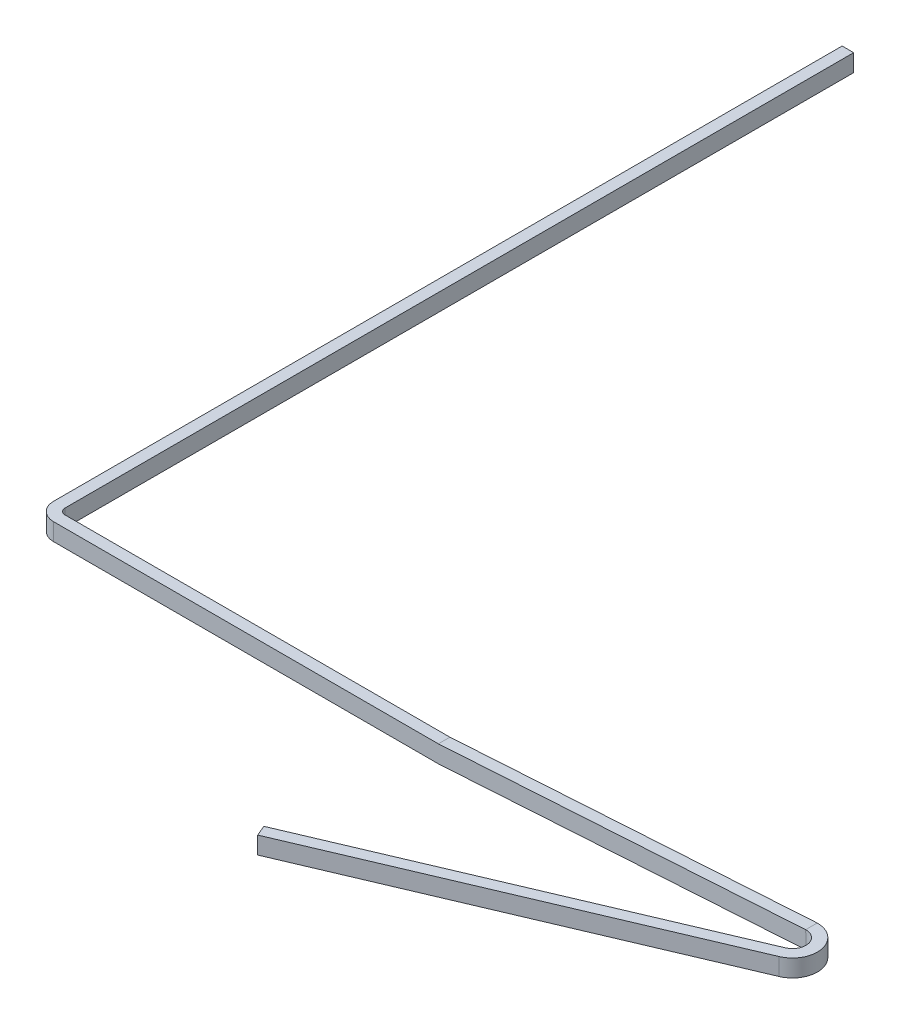
ISO-10303-21;
HEADER;
FILE_DESCRIPTION(('STEP AP214'),'2;1');
FILE_NAME('part.step','',(''),(''),'','','');
FILE_SCHEMA(('AUTOMOTIVE_DESIGN { 1 0 10303 214 1 1 1 1 }'));
ENDSEC;
DATA;
#1=APPLICATION_CONTEXT('core data for automotive mechanical design processes');
#2=APPLICATION_PROTOCOL_DEFINITION('international standard','automotive_design',2000,#1);
#3=PRODUCT_CONTEXT('',#1,'mechanical');
#4=PRODUCT('Part','Part','',(#3));
#5=PRODUCT_RELATED_PRODUCT_CATEGORY('part','',(#4));
#6=PRODUCT_DEFINITION_FORMATION('','',#4);
#7=PRODUCT_DEFINITION_CONTEXT('part definition',#1,'design');
#8=PRODUCT_DEFINITION('design','',#6,#7);
#9=PRODUCT_DEFINITION_SHAPE('','',#8);
#10=(LENGTH_UNIT() NAMED_UNIT(*) SI_UNIT(.MILLI.,.METRE.));
#11=(NAMED_UNIT(*) PLANE_ANGLE_UNIT() SI_UNIT($,.RADIAN.));
#12=(NAMED_UNIT(*) SI_UNIT($,.STERADIAN.) SOLID_ANGLE_UNIT());
#13=UNCERTAINTY_MEASURE_WITH_UNIT(LENGTH_MEASURE(1.E-05),#10,'distance_accuracy_value','');
#14=(GEOMETRIC_REPRESENTATION_CONTEXT(3) GLOBAL_UNCERTAINTY_ASSIGNED_CONTEXT((#13)) GLOBAL_UNIT_ASSIGNED_CONTEXT((#10,
#11,#12)) REPRESENTATION_CONTEXT('',''));
#15=CARTESIAN_POINT('',(0.,0.,0.));
#16=DIRECTION('',(0.,0.,1.));
#17=DIRECTION('',(1.,0.,0.));
#18=AXIS2_PLACEMENT_3D('',#15,#16,#17);
#19=CARTESIAN_POINT('',(0.31,-0.225,20.64));
#20=DIRECTION('',(0.,0.,-1.));
#21=DIRECTION('',(0.,1.,0.));
#22=AXIS2_PLACEMENT_3D('',#19,#20,#21);
#23=PLANE('',#22);
#24=DIRECTION('',(1.,0.,0.));
#25=VECTOR('',#24,1.);
#26=CARTESIAN_POINT('',(5.08347545353896,-0.225,20.64));
#27=LINE('',#26,#25);
#28=CARTESIAN_POINT('',(0.31,-0.225,20.64));
#29=VERTEX_POINT('',#28);
#30=CARTESIAN_POINT('',(10.3169509070779,-0.225,20.64));
#31=VERTEX_POINT('',#30);
#32=EDGE_CURVE('E289',#29,#31,#27,.T.);
#33=ORIENTED_EDGE('',*,*,#32,.F.);
#34=DIRECTION('',(0.,-1.,0.));
#35=VECTOR('',#34,1.);
#36=CARTESIAN_POINT('',(0.31,0.,20.64));
#37=LINE('',#36,#35);
#38=CARTESIAN_POINT('',(0.31,0.225,20.64));
#39=VERTEX_POINT('',#38);
#40=EDGE_CURVE('E313',#39,#29,#37,.T.);
#41=ORIENTED_EDGE('',*,*,#40,.F.);
#42=DIRECTION('',(-1.,0.,0.));
#43=VECTOR('',#42,1.);
#44=CARTESIAN_POINT('',(5.07652454646103,0.225,20.64));
#45=LINE('',#44,#43);
#46=CARTESIAN_POINT('',(10.3030490929221,0.225,20.64));
#47=VERTEX_POINT('',#46);
#48=EDGE_CURVE('E263',#47,#39,#45,.T.);
#49=ORIENTED_EDGE('',*,*,#48,.F.);
#50=DIRECTION('',(-0.998093074861909,-0.0617269302063447,0.));
#51=VECTOR('',#50,1.);
#52=CARTESIAN_POINT('',(15.073049092922,0.52,20.64));
#53=LINE('',#52,#51);
#54=CARTESIAN_POINT('',(19.8430490930153,0.815,20.6399992317516));
#55=VERTEX_POINT('',#54);
#56=EDGE_CURVE('E132',#55,#47,#53,.T.);
#57=ORIENTED_EDGE('',*,*,#56,.F.);
#58=CARTESIAN_POINT('',(19.8569503056948,0.365,20.6400473325914));
#59=CARTESIAN_POINT('',(19.8563251224778,0.383749856004702,20.6400393590207));
#60=CARTESIAN_POINT('',(19.8557040982407,0.402499851828986,20.6400324284622));
#61=CARTESIAN_POINT('',(19.8544713112831,0.439999843482708,20.6400205648319));
#62=CARTESIAN_POINT('',(19.8538595484122,0.458749839307196,20.6400156317276));
#63=CARTESIAN_POINT('',(19.8526462176853,0.496249841722893,20.6400076742821));
#64=CARTESIAN_POINT('',(19.8520446496561,0.514999848308494,20.6400046499084));
#65=CARTESIAN_POINT('',(19.8508506054591,0.552499815189423,20.640000941061));
#66=CARTESIAN_POINT('',(19.8502581291284,0.571249775479543,20.6400002565452));
#67=CARTESIAN_POINT('',(19.8490901129872,0.608749737456597,20.6399993823469));
#68=CARTESIAN_POINT('',(19.8485145727373,0.627499739129803,20.6399991926516));
#69=CARTESIAN_POINT('',(19.8473806719816,0.664999754281843,20.6399987753335));
#70=CARTESIAN_POINT('',(19.8468223110122,0.683749767746673,20.6399985477119));
#71=CARTESIAN_POINT('',(19.8457205182736,0.72124979070241,20.6399981852578));
#72=CARTESIAN_POINT('',(19.8451770861531,0.739999800183013,20.6399980504232));
#73=CARTESIAN_POINT('',(19.8441035231497,0.777499819151371,20.6399978383952));
#74=CARTESIAN_POINT('',(19.8435733919971,0.796249828631397,20.6399977612006));
#75=CARTESIAN_POINT('',(19.8430490932017,0.815,20.6399976952547));
#76=B_SPLINE_CURVE_WITH_KNOTS('',3,(#58,#59,#60,#61,#62,#63,#64,#65,#66,#67,#68,#69,#70,#71,#72,
#73,#74,#75),.UNSPECIFIED.,.F.,.F.,(4,2,2,2,2,2,2,2,4),(0.,0.0562808336383738,0.112560752718007,
0.168839714387137,0.225117666038422,0.281394155789539,0.337669125081047,0.393942769148206,
0.450215270750666),.UNSPECIFIED.);
#77=CARTESIAN_POINT('',(19.856950709507,0.364999999999999,20.6400217609745));
#78=VERTEX_POINT('',#77);
#79=EDGE_CURVE('E120',#55,#78,#76,.F.);
#80=ORIENTED_EDGE('',*,*,#79,.T.);
#81=DIRECTION('',(0.998093074861909,0.0617269302063444,0.));
#82=VECTOR('',#81,1.);
#83=CARTESIAN_POINT('',(15.0869509070779,0.07,20.64));
#84=LINE('',#83,#82);
#85=EDGE_CURVE('E147',#31,#78,#84,.T.);
#86=ORIENTED_EDGE('',*,*,#85,.F.);
#87=EDGE_LOOP('',(#33,#41,#49,#57,#80,#86));
#88=FACE_BOUND('',#87,.T.);
#89=ADVANCED_FACE('F15',(#88),#23,.T.);
#90=CARTESIAN_POINT('',(0.31,-0.27,20.48));
#91=DIRECTION('',(0.,1.,0.));
#92=DIRECTION('',(0.,0.,1.));
#93=AXIS2_PLACEMENT_3D('',#90,#91,#92);
#94=CYLINDRICAL_SURFACE('',#93,0.160000000000002);
#95=DIRECTION('',(0.,-1.,0.));
#96=VECTOR('',#95,1.);
#97=CARTESIAN_POINT('',(0.15,0.,20.48));
#98=LINE('',#97,#96);
#99=CARTESIAN_POINT('',(0.149999999999996,0.225,20.48));
#100=VERTEX_POINT('',#99);
#101=CARTESIAN_POINT('',(0.149999999999988,-0.225,20.48));
#102=VERTEX_POINT('',#101);
#103=EDGE_CURVE('E99',#100,#102,#98,.T.);
#104=ORIENTED_EDGE('',*,*,#103,.F.);
#105=CARTESIAN_POINT('',(0.31,0.225,20.48));
#106=DIRECTION('',(0.,1.,0.));
#107=DIRECTION('',(0.,0.,1.));
#108=AXIS2_PLACEMENT_3D('',#105,#106,#107);
#109=CIRCLE('',#108,0.160000000000002);
#110=EDGE_CURVE('E490',#39,#100,#109,.F.);
#111=ORIENTED_EDGE('',*,*,#110,.F.);
#112=ORIENTED_EDGE('',*,*,#40,.T.);
#113=CARTESIAN_POINT('',(0.31,-0.225,20.48));
#114=DIRECTION('',(0.,1.,0.));
#115=DIRECTION('',(0.,0.,1.));
#116=AXIS2_PLACEMENT_3D('',#113,#114,#115);
#117=CIRCLE('',#116,0.160000000000002);
#118=EDGE_CURVE('E19',#102,#29,#117,.T.);
#119=ORIENTED_EDGE('',*,*,#118,.F.);
#120=EDGE_LOOP('',(#104,#111,#112,#119));
#121=FACE_BOUND('',#120,.T.);
#122=ADVANCED_FACE('F467',(#121),#94,.F.);
#123=CARTESIAN_POINT('',(0.15,-0.225,0.));
#124=DIRECTION('',(1.,0.,0.));
#125=DIRECTION('',(0.,1.,0.));
#126=AXIS2_PLACEMENT_3D('',#123,#124,#125);
#127=PLANE('',#126);
#128=DIRECTION('',(0.,-1.,0.));
#129=VECTOR('',#128,1.);
#130=CARTESIAN_POINT('',(0.15,0.,0.));
#131=LINE('',#130,#129);
#132=CARTESIAN_POINT('',(0.149999999999995,0.225,0.));
#133=VERTEX_POINT('',#132);
#134=CARTESIAN_POINT('',(0.149999999999989,-0.225,0.));
#135=VERTEX_POINT('',#134);
#136=EDGE_CURVE('E111',#133,#135,#131,.T.);
#137=ORIENTED_EDGE('',*,*,#136,.F.);
#138=DIRECTION('',(0.,0.,-1.));
#139=VECTOR('',#138,1.);
#140=CARTESIAN_POINT('',(0.149999999999992,0.225,10.47));
#141=LINE('',#140,#139);
#142=EDGE_CURVE('E306',#100,#133,#141,.T.);
#143=ORIENTED_EDGE('',*,*,#142,.F.);
#144=ORIENTED_EDGE('',*,*,#103,.T.);
#145=DIRECTION('',(0.,0.,1.));
#146=VECTOR('',#145,1.);
#147=CARTESIAN_POINT('',(0.149999999999976,-0.225,10.47));
#148=LINE('',#147,#146);
#149=EDGE_CURVE('E280',#135,#102,#148,.T.);
#150=ORIENTED_EDGE('',*,*,#149,.F.);
#151=EDGE_LOOP('',(#137,#143,#144,#150));
#152=FACE_BOUND('',#151,.T.);
#153=ADVANCED_FACE('F458',(#152),#127,.T.);
#154=CARTESIAN_POINT('',(0.15,-0.225,0.));
#155=DIRECTION('',(0.,0.,-1.));
#156=DIRECTION('',(-1.,0.,0.));
#157=AXIS2_PLACEMENT_3D('',#154,#155,#156);
#158=PLANE('',#157);
#159=DIRECTION('',(0.,-1.,0.));
#160=VECTOR('',#159,1.);
#161=CARTESIAN_POINT('',(-0.15,0.,0.));
#162=LINE('',#161,#160);
#163=CARTESIAN_POINT('',(-0.15,0.225,0.));
#164=VERTEX_POINT('',#163);
#165=CARTESIAN_POINT('',(-0.149999999999999,-0.225,0.));
#166=VERTEX_POINT('',#165);
#167=EDGE_CURVE('E294',#164,#166,#162,.T.);
#168=ORIENTED_EDGE('',*,*,#167,.F.);
#169=DIRECTION('',(-1.,0.,0.));
#170=VECTOR('',#169,1.);
#171=CARTESIAN_POINT('',(5.07652454646103,0.225,0.));
#172=LINE('',#171,#170);
#173=EDGE_CURVE('E302',#133,#164,#172,.T.);
#174=ORIENTED_EDGE('',*,*,#173,.F.);
#175=ORIENTED_EDGE('',*,*,#136,.T.);
#176=DIRECTION('',(1.,0.,0.));
#177=VECTOR('',#176,1.);
#178=CARTESIAN_POINT('',(5.08347545353896,-0.225,0.));
#179=LINE('',#178,#177);
#180=EDGE_CURVE('E283',#166,#135,#179,.T.);
#181=ORIENTED_EDGE('',*,*,#180,.F.);
#182=EDGE_LOOP('',(#168,#174,#175,#181));
#183=FACE_BOUND('',#182,.T.);
#184=ADVANCED_FACE('F448',(#183),#158,.T.);
#185=CARTESIAN_POINT('',(-0.15,0.225,0.));
#186=DIRECTION('',(-1.,0.,0.));
#187=DIRECTION('',(0.,-1.,0.));
#188=AXIS2_PLACEMENT_3D('',#185,#186,#187);
#189=PLANE('',#188);
#190=DIRECTION('',(0.,0.,1.));
#191=VECTOR('',#190,1.);
#192=CARTESIAN_POINT('',(-0.15,0.225,10.47));
#193=LINE('',#192,#191);
#194=CARTESIAN_POINT('',(-0.15,0.225,20.48));
#195=VERTEX_POINT('',#194);
#196=EDGE_CURVE('E305',#164,#195,#193,.T.);
#197=ORIENTED_EDGE('',*,*,#196,.F.);
#198=ORIENTED_EDGE('',*,*,#167,.T.);
#199=DIRECTION('',(0.,0.,-1.));
#200=VECTOR('',#199,1.);
#201=CARTESIAN_POINT('',(-0.15,-0.225,10.47));
#202=LINE('',#201,#200);
#203=CARTESIAN_POINT('',(-0.15,-0.225,20.48));
#204=VERTEX_POINT('',#203);
#205=EDGE_CURVE('E286',#204,#166,#202,.T.);
#206=ORIENTED_EDGE('',*,*,#205,.F.);
#207=DIRECTION('',(0.,1.,0.));
#208=VECTOR('',#207,1.);
#209=CARTESIAN_POINT('',(-0.15,0.,20.48));
#210=LINE('',#209,#208);
#211=EDGE_CURVE('E297',#204,#195,#210,.T.);
#212=ORIENTED_EDGE('',*,*,#211,.T.);
#213=EDGE_LOOP('',(#197,#198,#206,#212));
#214=FACE_BOUND('',#213,.T.);
#215=ADVANCED_FACE('F438',(#214),#189,.T.);
#216=CARTESIAN_POINT('',(-0.15,-0.225,20.94));
#217=DIRECTION('',(0.,-1.,0.));
#218=DIRECTION('',(0.,0.,-1.));
#219=AXIS2_PLACEMENT_3D('',#216,#217,#218);
#220=PLANE('',#219);
#221=ORIENTED_EDGE('',*,*,#149,.T.);
#222=ORIENTED_EDGE('',*,*,#118,.T.);
#223=ORIENTED_EDGE('',*,*,#32,.T.);
#224=DIRECTION('',(0.,0.,-1.));
#225=VECTOR('',#224,1.);
#226=CARTESIAN_POINT('',(10.3169509070779,-0.225,20.79));
#227=LINE('',#226,#225);
#228=CARTESIAN_POINT('',(10.3169509070779,-0.225000000000001,20.94));
#229=VERTEX_POINT('',#228);
#230=EDGE_CURVE('E151',#229,#31,#227,.T.);
#231=ORIENTED_EDGE('',*,*,#230,.F.);
#232=DIRECTION('',(1.,0.,0.));
#233=VECTOR('',#232,1.);
#234=CARTESIAN_POINT('',(10.1421163062602,-0.225,20.94));
#235=LINE('',#234,#233);
#236=CARTESIAN_POINT('',(0.310000000000003,-0.225,20.94));
#237=VERTEX_POINT('',#236);
#238=EDGE_CURVE('E163',#237,#229,#235,.T.);
#239=ORIENTED_EDGE('',*,*,#238,.F.);
#240=CARTESIAN_POINT('',(0.310000000000006,-0.225,20.48));
#241=DIRECTION('',(0.,1.,0.));
#242=DIRECTION('',(0.,0.,1.));
#243=AXIS2_PLACEMENT_3D('',#240,#241,#242);
#244=CIRCLE('',#243,0.460000000000002);
#245=EDGE_CURVE('E498',#204,#237,#244,.T.);
#246=ORIENTED_EDGE('',*,*,#245,.F.);
#247=ORIENTED_EDGE('',*,*,#205,.T.);
#248=ORIENTED_EDGE('',*,*,#180,.T.);
#249=EDGE_LOOP('',(#221,#222,#223,#231,#239,#246,#247,#248));
#250=FACE_BOUND('',#249,.T.);
#251=ADVANCED_FACE('F429',(#250),#220,.T.);
#252=CARTESIAN_POINT('',(10.3169509070779,-0.225,20.64));
#253=DIRECTION('',(0.0617269302063444,-0.99809307486191,0.));
#254=DIRECTION('',(0.99809307486191,0.0617269302063444,0.));
#255=AXIS2_PLACEMENT_3D('',#252,#253,#254);
#256=PLANE('',#255);
#257=DIRECTION('',(0.998093074861909,0.0617269302063443,0.));
#258=VECTOR('',#257,1.);
#259=CARTESIAN_POINT('',(10.316950907078,-0.225,20.94));
#260=LINE('',#259,#258);
#261=CARTESIAN_POINT('',(19.8569506919275,0.364999999999999,20.9400311248954));
#262=VERTEX_POINT('',#261);
#263=EDGE_CURVE('E145',#229,#262,#260,.T.);
#264=ORIENTED_EDGE('',*,*,#263,.F.);
#265=ORIENTED_EDGE('',*,*,#230,.T.);
#266=ORIENTED_EDGE('',*,*,#85,.T.);
#267=DIRECTION('',(0.,0.,1.));
#268=VECTOR('',#267,1.);
#269=CARTESIAN_POINT('',(19.8569509070779,0.364999999999996,20.64));
#270=LINE('',#269,#268);
#271=EDGE_CURVE('E141',#78,#262,#270,.T.);
#272=ORIENTED_EDGE('',*,*,#271,.T.);
#273=EDGE_LOOP('',(#264,#265,#266,#272));
#274=FACE_BOUND('',#273,.T.);
#275=ADVANCED_FACE('F143',(#274),#256,.T.);
#276=CARTESIAN_POINT('',(19.843049092922,0.815,20.64));
#277=DIRECTION('',(-0.0617269302063447,0.998093074861909,0.));
#278=DIRECTION('',(-0.998093074861909,-0.0617269302063447,0.));
#279=AXIS2_PLACEMENT_3D('',#276,#277,#278);
#280=PLANE('',#279);
#281=ORIENTED_EDGE('',*,*,#56,.T.);
#282=DIRECTION('',(0.,0.,-1.));
#283=VECTOR('',#282,1.);
#284=CARTESIAN_POINT('',(10.3030490929221,0.225,10.47));
#285=LINE('',#284,#283);
#286=CARTESIAN_POINT('',(10.3030490929222,0.225000000000005,20.94));
#287=VERTEX_POINT('',#286);
#288=EDGE_CURVE('E265',#287,#47,#285,.T.);
#289=ORIENTED_EDGE('',*,*,#288,.F.);
#290=DIRECTION('',(-0.998093074861909,-0.0617269302063443,0.));
#291=VECTOR('',#290,1.);
#292=CARTESIAN_POINT('',(19.8430490929221,0.815,20.94));
#293=LINE('',#292,#291);
#294=CARTESIAN_POINT('',(19.8430490929268,0.814999999866568,20.9399995712492));
#295=VERTEX_POINT('',#294);
#296=EDGE_CURVE('E164',#295,#287,#293,.T.);
#297=ORIENTED_EDGE('',*,*,#296,.F.);
#298=DIRECTION('',(0.,0.,-1.));
#299=VECTOR('',#298,1.);
#300=CARTESIAN_POINT('',(19.843049092922,0.815,20.79));
#301=LINE('',#300,#299);
#302=EDGE_CURVE('E259',#295,#55,#301,.T.);
#303=ORIENTED_EDGE('',*,*,#302,.T.);
#304=EDGE_LOOP('',(#281,#289,#297,#303));
#305=FACE_BOUND('',#304,.T.);
#306=ADVANCED_FACE('F267',(#305),#280,.T.);
#307=CARTESIAN_POINT('',(-0.15,0.225,0.));
#308=DIRECTION('',(0.,1.,0.));
#309=DIRECTION('',(0.,0.,1.));
#310=AXIS2_PLACEMENT_3D('',#307,#308,#309);
#311=PLANE('',#310);
#312=ORIENTED_EDGE('',*,*,#196,.T.);
#313=CARTESIAN_POINT('',(0.310000000000006,0.225,20.48));
#314=DIRECTION('',(0.,1.,0.));
#315=DIRECTION('',(0.,0.,1.));
#316=AXIS2_PLACEMENT_3D('',#313,#314,#315);
#317=CIRCLE('',#316,0.460000000000002);
#318=CARTESIAN_POINT('',(0.310000000000003,0.225000000000002,20.94));
#319=VERTEX_POINT('',#318);
#320=EDGE_CURVE('E279',#319,#195,#317,.F.);
#321=ORIENTED_EDGE('',*,*,#320,.F.);
#322=DIRECTION('',(-1.,0.,0.));
#323=VECTOR('',#322,1.);
#324=CARTESIAN_POINT('',(10.1421163062602,0.225000000000003,20.94));
#325=LINE('',#324,#323);
#326=EDGE_CURVE('E507',#287,#319,#325,.T.);
#327=ORIENTED_EDGE('',*,*,#326,.F.);
#328=ORIENTED_EDGE('',*,*,#288,.T.);
#329=ORIENTED_EDGE('',*,*,#48,.T.);
#330=ORIENTED_EDGE('',*,*,#110,.T.);
#331=ORIENTED_EDGE('',*,*,#142,.T.);
#332=ORIENTED_EDGE('',*,*,#173,.T.);
#333=EDGE_LOOP('',(#312,#321,#327,#328,#329,#330,#331,#332));
#334=FACE_BOUND('',#333,.T.);
#335=ADVANCED_FACE('F403',(#334),#311,.T.);
#336=CARTESIAN_POINT('',(0.310000000000006,-0.27,20.48));
#337=DIRECTION('',(0.,1.,0.));
#338=DIRECTION('',(0.,0.,1.));
#339=AXIS2_PLACEMENT_3D('',#336,#337,#338);
#340=CYLINDRICAL_SURFACE('',#339,0.460000000000002);
#341=ORIENTED_EDGE('',*,*,#320,.T.);
#342=ORIENTED_EDGE('',*,*,#211,.F.);
#343=ORIENTED_EDGE('',*,*,#245,.T.);
#344=DIRECTION('',(0.,-1.,0.));
#345=VECTOR('',#344,1.);
#346=CARTESIAN_POINT('',(0.31,0.29812,20.94));
#347=LINE('',#346,#345);
#348=EDGE_CURVE('E343',#319,#237,#347,.T.);
#349=ORIENTED_EDGE('',*,*,#348,.F.);
#350=EDGE_LOOP('',(#341,#342,#343,#349));
#351=FACE_BOUND('',#350,.T.);
#352=ADVANCED_FACE('F395',(#351),#340,.T.);
#353=CARTESIAN_POINT('',(0.31,0.82124,20.94));
#354=DIRECTION('',(0.,0.,1.));
#355=DIRECTION('',(0.,-1.,0.));
#356=AXIS2_PLACEMENT_3D('',#353,#354,#355);
#357=PLANE('',#356);
#358=ORIENTED_EDGE('',*,*,#326,.T.);
#359=ORIENTED_EDGE('',*,*,#348,.T.);
#360=ORIENTED_EDGE('',*,*,#238,.T.);
#361=ORIENTED_EDGE('',*,*,#263,.T.);
#362=CARTESIAN_POINT('',(19.8430490929238,0.815,20.9399987137475));
#363=CARTESIAN_POINT('',(19.8437191000636,0.796250353380755,20.9399987561626));
#364=CARTESIAN_POINT('',(19.8443797193181,0.777500368219308,20.939998780921));
#365=CARTESIAN_POINT('',(19.8456787970251,0.740000397863294,20.9399988821435));
#366=CARTESIAN_POINT('',(19.846317256382,0.721250412700028,20.9399989586054));
#367=CARTESIAN_POINT('',(19.8475686554807,0.68375045871046,20.9399992502362));
#368=CARTESIAN_POINT('',(19.8481815964072,0.665000489923895,20.9399994653987));
#369=CARTESIAN_POINT('',(19.849374636556,0.627500449377767,20.9399996557056));
#370=CARTESIAN_POINT('',(19.8499547374219,0.608750377670414,20.9399996308622));
#371=CARTESIAN_POINT('',(19.8510946296351,0.571250287732786,20.9400013299713));
#372=CARTESIAN_POINT('',(19.8516544217022,0.552500269524227,20.9400030538616));
#373=CARTESIAN_POINT('',(19.852756897063,0.515000244423073,20.9400084202379));
#374=CARTESIAN_POINT('',(19.8532995808251,0.496250237544255,20.9400120626711));
#375=CARTESIAN_POINT('',(19.8543687156374,0.458750221816239,20.9400212247247));
#376=CARTESIAN_POINT('',(19.8548951670849,0.440000212978343,20.940026744299));
#377=CARTESIAN_POINT('',(19.8559332938106,0.402500195294239,20.9400396720255));
#378=CARTESIAN_POINT('',(19.8564449694102,0.38375018645692,20.9400470801365));
#379=CARTESIAN_POINT('',(19.8569499898271,0.365,20.9400554383208));
#380=B_SPLINE_CURVE_WITH_KNOTS('',3,(#362,#363,#364,#365,#366,#367,#368,#369,#370,#371,#372,
#373,#374,#375,#376,#377,#378,#379),.UNSPECIFIED.,.F.,.F.,(4,2,2,2,2,2,2,2,4),(0.,
0.0562848434924861,0.112567387358702,0.168847315538543,0.225124424387782,0.281399536105606,
0.337673105315378,0.393945295883705,0.450216261165014),.UNSPECIFIED.);
#381=EDGE_CURVE('E159',#295,#262,#380,.T.);
#382=ORIENTED_EDGE('',*,*,#381,.F.);
#383=ORIENTED_EDGE('',*,*,#296,.T.);
#384=EDGE_LOOP('',(#358,#359,#360,#361,#382,#383));
#385=FACE_BOUND('',#384,.T.);
#386=ADVANCED_FACE('F157',(#385),#357,.T.);
#387=CARTESIAN_POINT('',(10.4212086650717,0.815,20.64));
#388=DIRECTION('',(0.,1.,0.));
#389=DIRECTION('',(0.,0.,1.));
#390=AXIS2_PLACEMENT_3D('',#387,#388,#389);
#391=PLANE('',#390);
#392=DIRECTION('',(1.,0.,0.));
#393=VECTOR('',#392,1.);
#394=CARTESIAN_POINT('',(10.4212086650717,0.815,20.9399987137475));
#395=LINE('',#394,#393);
#396=CARTESIAN_POINT('',(19.849999999999,0.815,20.94));
#397=VERTEX_POINT('',#396);
#398=EDGE_CURVE('E174',#397,#295,#395,.F.);
#399=ORIENTED_EDGE('',*,*,#398,.F.);
#400=CARTESIAN_POINT('',(19.9868982813718,0.815,21.6121162221271));
#401=CARTESIAN_POINT('',(20.0232168228054,0.815,21.5967167026278));
#402=CARTESIAN_POINT('',(20.0567935222807,0.815,21.5749093463835));
#403=CARTESIAN_POINT('',(20.1150871937298,0.815,21.521629948673));
#404=CARTESIAN_POINT('',(20.1398090794989,0.815,21.4901632854997));
#405=CARTESIAN_POINT('',(20.1770496477912,0.815,21.4207206403007));
#406=CARTESIAN_POINT('',(20.1895783151174,0.815,21.3827500142693));
#407=CARTESIAN_POINT('',(20.2016835784681,0.815,21.3049572144617));
#408=CARTESIAN_POINT('',(20.2013107429841,0.815,21.2651428803674));
#409=CARTESIAN_POINT('',(20.1870501990881,0.815,21.1877618490352));
#410=CARTESIAN_POINT('',(20.1730864788599,0.815,21.1502090549944));
#411=CARTESIAN_POINT('',(20.1339141892116,0.815,21.0819440356132));
#412=CARTESIAN_POINT('',(20.1087884775298,0.815,21.0511838609033));
#413=CARTESIAN_POINT('',(20.0493423644816,0.815,20.9995690520426));
#414=CARTESIAN_POINT('',(20.0149443224729,0.815,20.9788023863391));
#415=CARTESIAN_POINT('',(19.9578545314167,0.815,20.9563095378118));
#416=CARTESIAN_POINT('',(19.9367640847145,0.815,20.9502226907248));
#417=CARTESIAN_POINT('',(19.8937994275221,0.815,20.9420615933635));
#418=CARTESIAN_POINT('',(19.8719244702853,0.815,20.9399912753899));
#419=CARTESIAN_POINT('',(19.8499999999986,0.815,20.94));
#420=B_SPLINE_CURVE_WITH_KNOTS('',3,(#400,#401,#402,#403,#404,#405,#406,#407,#408,#409,#410,
#411,#412,#413,#414,#415,#416,#417,#418,#419),.UNSPECIFIED.,.F.,.F.,(4,2,2,2,2,2,2,2,2,4),(0.,
0.117848498601319,0.235631497928369,0.353317965559507,0.470543203933686,0.588427855554342,
0.705451679314923,0.823487579409254,0.889004181516532,0.954584894010534),.UNSPECIFIED.);
#421=CARTESIAN_POINT('',(19.9868982813718,0.815,21.6121162221271));
#422=VERTEX_POINT('',#421);
#423=EDGE_CURVE('E226',#422,#397,#420,.T.);
#424=ORIENTED_EDGE('',*,*,#423,.F.);
#425=DIRECTION('',(0.920332063220277,0.,-0.391137946776719));
#426=VECTOR('',#425,1.);
#427=CARTESIAN_POINT('',(15.2341137946777,0.815,23.632033206322));
#428=LINE('',#427,#426);
#429=CARTESIAN_POINT('',(10.4813293079835,0.815,25.651950190517));
#430=VERTEX_POINT('',#429);
#431=EDGE_CURVE('E176',#430,#422,#428,.T.);
#432=ORIENTED_EDGE('',*,*,#431,.F.);
#433=DIRECTION('',(0.391137946776804,0.,0.920332063220241));
#434=VECTOR('',#433,1.);
#435=CARTESIAN_POINT('',(10.4813293079835,0.815,25.651950190517));
#436=LINE('',#435,#434);
#437=CARTESIAN_POINT('',(10.5986706920165,0.815,25.928049809483));
#438=VERTEX_POINT('',#437);
#439=EDGE_CURVE('E235',#430,#438,#436,.T.);
#440=ORIENTED_EDGE('',*,*,#439,.T.);
#441=DIRECTION('',(-0.920332063220278,0.,0.391137946776717));
#442=VECTOR('',#441,1.);
#443=CARTESIAN_POINT('',(15.3514551787107,0.815,23.9081328252881));
#444=LINE('',#443,#442);
#445=CARTESIAN_POINT('',(20.1042396654049,0.815,21.8882158410932));
#446=VERTEX_POINT('',#445);
#447=EDGE_CURVE('E340',#446,#438,#444,.T.);
#448=ORIENTED_EDGE('',*,*,#447,.F.);
#449=CARTESIAN_POINT('',(19.85,0.815,20.64));
#450=CARTESIAN_POINT('',(19.8883606594569,0.815,20.6400043187599));
#451=CARTESIAN_POINT('',(19.9266209385164,0.815,20.6434038848482));
#452=CARTESIAN_POINT('',(20.0019415597411,0.815,20.6568465049287));
#453=CARTESIAN_POINT('',(20.039002308775,0.815,20.6668872809852));
#454=CARTESIAN_POINT('',(20.1435320282847,0.815,20.7055004010783));
#455=CARTESIAN_POINT('',(20.2081440251931,0.815,20.7426203853232));
#456=CARTESIAN_POINT('',(20.2925656869376,0.815,20.8125639201111));
#457=CARTESIAN_POINT('',(20.3186383891133,0.815,20.8382803707192));
#458=CARTESIAN_POINT('',(20.3661720771772,0.815,20.8937547333409));
#459=CARTESIAN_POINT('',(20.3876291528474,0.815,20.9235160374769));
#460=CARTESIAN_POINT('',(20.4253439325006,0.815,20.9861354727813));
#461=CARTESIAN_POINT('',(20.4416047914566,0.815,21.0189917090553));
#462=CARTESIAN_POINT('',(20.4684359321939,0.815,21.086962908581));
#463=CARTESIAN_POINT('',(20.4790028885499,0.815,21.1220791783942));
#464=CARTESIAN_POINT('',(20.5012540661674,0.815,21.2293255295457));
#465=CARTESIAN_POINT('',(20.5036128932809,0.815,21.3035587484418));
#466=CARTESIAN_POINT('',(20.4841916893231,0.815,21.448598584409));
#467=CARTESIAN_POINT('',(20.4624709915608,0.815,21.5194131773758));
#468=CARTESIAN_POINT('',(20.41297413281,0.815,21.6169868626307));
#469=CARTESIAN_POINT('',(20.3935562915536,0.815,21.6481653519028));
#470=CARTESIAN_POINT('',(20.3497359898803,0.815,21.7068684213278));
#471=CARTESIAN_POINT('',(20.3253277505728,0.815,21.7343887037457));
#472=CARTESIAN_POINT('',(20.2705486135113,0.815,21.7866956558066));
#473=CARTESIAN_POINT('',(20.2398905989952,0.815,21.8111822524823));
#474=CARTESIAN_POINT('',(20.174723418557,0.815,21.8542980704109));
#475=CARTESIAN_POINT('',(20.1402156647726,0.815,21.872929429936));
#476=CARTESIAN_POINT('',(20.1042396654049,0.815,21.8882158410932));
#477=B_SPLINE_CURVE_WITH_KNOTS('',3,(#449,#450,#451,#452,#453,#454,#455,#456,#457,#458,#459,
#460,#461,#462,#463,#464,#465,#466,#467,#468,#469,#470,#471,#472,#473,#474,#475,#476),
.UNSPECIFIED.,.F.,.F.,(4,2,2,2,2,2,2,2,2,2,2,2,2,4),(0.,0.114735445989212,0.229431558106395,
0.447998711030945,0.557446763098243,0.66698717420565,0.776460949023039,0.885998590996578,
1.10439143493677,1.32224734030533,1.43195857758302,1.54179758766612,1.65888211010858,
1.77592382467119),.UNSPECIFIED.);
#478=CARTESIAN_POINT('',(19.85,0.815,20.64));
#479=VERTEX_POINT('',#478);
#480=EDGE_CURVE('E248',#479,#446,#477,.T.);
#481=ORIENTED_EDGE('',*,*,#480,.F.);
#482=DIRECTION('',(1.,0.,0.));
#483=VECTOR('',#482,1.);
#484=CARTESIAN_POINT('',(10.4212086650717,0.815,20.64));
#485=LINE('',#484,#483);
#486=EDGE_CURVE('E255',#55,#479,#485,.T.);
#487=ORIENTED_EDGE('',*,*,#486,.F.);
#488=ORIENTED_EDGE('',*,*,#302,.F.);
#489=EDGE_LOOP('',(#399,#424,#432,#440,#448,#481,#487,#488));
#490=FACE_BOUND('',#489,.T.);
#491=ADVANCED_FACE('F237',(#490),#391,.T.);
#492=CARTESIAN_POINT('',(10.5986706920165,0.365,25.928049809483));
#493=DIRECTION('',(0.391137946776717,0.,0.920332063220278));
#494=DIRECTION('',(0.920332063220278,0.,-0.391137946776717));
#495=AXIS2_PLACEMENT_3D('',#492,#493,#494);
#496=PLANE('',#495);
#497=DIRECTION('',(-0.920332063220278,0.,0.391137946776718));
#498=VECTOR('',#497,1.);
#499=CARTESIAN_POINT('',(20.1042396654049,0.365,21.8882158410932));
#500=LINE('',#499,#498);
#501=CARTESIAN_POINT('',(20.1042396654049,0.365,21.8882158410932));
#502=VERTEX_POINT('',#501);
#503=CARTESIAN_POINT('',(10.5986706920165,0.365,25.928049809483));
#504=VERTEX_POINT('',#503);
#505=EDGE_CURVE('E185',#502,#504,#500,.T.);
#506=ORIENTED_EDGE('',*,*,#505,.F.);
#507=DIRECTION('',(0.,-1.,0.));
#508=VECTOR('',#507,1.);
#509=CARTESIAN_POINT('',(20.1042396654049,0.59,21.8882158410932));
#510=LINE('',#509,#508);
#511=EDGE_CURVE('E254',#446,#502,#510,.T.);
#512=ORIENTED_EDGE('',*,*,#511,.F.);
#513=ORIENTED_EDGE('',*,*,#447,.T.);
#514=DIRECTION('',(0.,-1.,0.));
#515=VECTOR('',#514,1.);
#516=CARTESIAN_POINT('',(10.5986706920165,0.59,25.928049809483));
#517=LINE('',#516,#515);
#518=EDGE_CURVE('E337',#438,#504,#517,.T.);
#519=ORIENTED_EDGE('',*,*,#518,.T.);
#520=EDGE_LOOP('',(#506,#512,#513,#519));
#521=FACE_BOUND('',#520,.T.);
#522=ADVANCED_FACE('F242',(#521),#496,.T.);
#523=CARTESIAN_POINT('',(19.9868982813718,0.365,21.6121162221271));
#524=DIRECTION('',(-0.391137946776719,0.,-0.920332063220277));
#525=DIRECTION('',(-0.920332063220277,0.,0.391137946776719));
#526=AXIS2_PLACEMENT_3D('',#523,#524,#525);
#527=PLANE('',#526);
#528=ORIENTED_EDGE('',*,*,#431,.T.);
#529=DIRECTION('',(0.,1.,0.));
#530=VECTOR('',#529,1.);
#531=CARTESIAN_POINT('',(19.9868982813718,0.59,21.6121162221271));
#532=LINE('',#531,#530);
#533=CARTESIAN_POINT('',(19.9868982813718,0.365,21.6121162221271));
#534=VERTEX_POINT('',#533);
#535=EDGE_CURVE('E175',#534,#422,#532,.T.);
#536=ORIENTED_EDGE('',*,*,#535,.F.);
#537=DIRECTION('',(0.920332063220279,0.,-0.391137946776714));
#538=VECTOR('',#537,1.);
#539=CARTESIAN_POINT('',(10.4813293079835,0.365,25.6519501905169));
#540=LINE('',#539,#538);
#541=CARTESIAN_POINT('',(10.4813293079835,0.365,25.6519501905169));
#542=VERTEX_POINT('',#541);
#543=EDGE_CURVE('E182',#542,#534,#540,.T.);
#544=ORIENTED_EDGE('',*,*,#543,.F.);
#545=DIRECTION('',(0.,1.,0.));
#546=VECTOR('',#545,1.);
#547=CARTESIAN_POINT('',(10.4813293079835,0.59,25.651950190517));
#548=LINE('',#547,#546);
#549=EDGE_CURVE('E33',#542,#430,#548,.T.);
#550=ORIENTED_EDGE('',*,*,#549,.T.);
#551=EDGE_LOOP('',(#528,#536,#544,#550));
#552=FACE_BOUND('',#551,.T.);
#553=ADVANCED_FACE('F208',(#552),#527,.T.);
#554=CARTESIAN_POINT('',(19.8345421041795,0.815,20.9399992488119));
#555=CARTESIAN_POINT('',(19.8400620899661,0.815,20.9399986421243));
#556=CARTESIAN_POINT('',(19.8455290769014,0.815,20.9399981590898));
#557=CARTESIAN_POINT('',(19.8621487614917,0.815,20.9400050022732));
#558=CARTESIAN_POINT('',(19.870001593979,0.815,20.9404291023397));
#559=CARTESIAN_POINT('',(19.889915868963,0.815,20.9421399708764));
#560=CARTESIAN_POINT('',(19.8998334632571,0.815,20.9434218193108));
#561=CARTESIAN_POINT('',(19.9293659714026,0.815,20.9485321680292));
#562=CARTESIAN_POINT('',(19.948760688396,0.815,20.9536290289917));
#563=CARTESIAN_POINT('',(20.005210450649,0.815,20.9737625398497));
#564=CARTESIAN_POINT('',(20.0404741867122,0.815,20.9936625385646));
#565=CARTESIAN_POINT('',(20.1333023700788,0.815,21.0694892431178));
#566=CARTESIAN_POINT('',(20.1770098672595,0.815,21.1418453600298));
#567=CARTESIAN_POINT('',(20.2089065675115,0.815,21.2984454974239));
#568=CARTESIAN_POINT('',(20.196982448521,0.815,21.3821326817591));
#569=CARTESIAN_POINT('',(20.1226169077395,0.815,21.5235921065538));
#570=CARTESIAN_POINT('',(20.0605491717277,0.815,21.5808148482173));
#571=CARTESIAN_POINT('',(19.9868982813718,0.815,21.6121162221271));
#572=CARTESIAN_POINT('',(19.8345421041795,0.365,20.9399992488119));
#573=CARTESIAN_POINT('',(19.8400620899661,0.365,20.9399986421243));
#574=CARTESIAN_POINT('',(19.8455290769014,0.365,20.9399981590898));
#575=CARTESIAN_POINT('',(19.8621487614917,0.365,20.9400050022732));
#576=CARTESIAN_POINT('',(19.870001593979,0.365,20.9404291023397));
#577=CARTESIAN_POINT('',(19.889915868963,0.365,20.9421399708764));
#578=CARTESIAN_POINT('',(19.8998334632571,0.365,20.9434218193108));
#579=CARTESIAN_POINT('',(19.9293659714026,0.365,20.9485321680292));
#580=CARTESIAN_POINT('',(19.948760688396,0.365,20.9536290289917));
#581=CARTESIAN_POINT('',(20.005210450649,0.365,20.9737625398497));
#582=CARTESIAN_POINT('',(20.0404741867122,0.365,20.9936625385646));
#583=CARTESIAN_POINT('',(20.1333023700788,0.365,21.0694892431178));
#584=CARTESIAN_POINT('',(20.1770098672595,0.365,21.1418453600298));
#585=CARTESIAN_POINT('',(20.2089065675115,0.365,21.2984454974239));
#586=CARTESIAN_POINT('',(20.196982448521,0.365,21.3821326817591));
#587=CARTESIAN_POINT('',(20.1226169077395,0.365,21.5235921065538));
#588=CARTESIAN_POINT('',(20.0605491717277,0.365,21.5808148482173));
#589=CARTESIAN_POINT('',(19.9868982813718,0.365,21.6121162221271));
#590=B_SPLINE_SURFACE_WITH_KNOTS('',1,3,((#554,#555,#556,#557,#558,#559,#560,#561,#562,#563,
#564,#565,#566,#567,#568,#569,#570,#571),(#572,#573,#574,#575,#576,#577,#578,#579,#580,#581,
#582,#583,#584,#585,#586,#587,#588,#589)),.UNSPECIFIED.,.F.,.F.,.F.,(2,2),(4,2,2,2,2,2,2,2,4),
(0.,1.),(-0.00134669846601,0.,0.00365936029408,0.00731872058815,0.0146374411763,
0.02927488235261,0.05854976470521,0.08782464705782,0.11709952941042),.UNSPECIFIED.);
#591=CARTESIAN_POINT('',(19.9868982813718,0.365,21.6121162221271));
#592=CARTESIAN_POINT('',(20.0232168150112,0.365,21.5967166998181));
#593=CARTESIAN_POINT('',(20.0567935183847,0.365,21.5749093449791));
#594=CARTESIAN_POINT('',(20.1150871976237,0.365,21.5216299500767));
#595=CARTESIAN_POINT('',(20.1398090872844,0.365,21.4901632883063));
#596=CARTESIAN_POINT('',(20.1770496400121,0.365,21.4207206374964));
#597=CARTESIAN_POINT('',(20.1895782879013,0.365,21.382750004458));
#598=CARTESIAN_POINT('',(20.2016836055776,0.365,21.3049572242344));
#599=CARTESIAN_POINT('',(20.2013108434915,0.365,21.2651429165995));
#600=CARTESIAN_POINT('',(20.1870500980153,0.365,21.1877618125992));
#601=CARTESIAN_POINT('',(20.1730861008471,0.365,21.1502089187237));
#602=CARTESIAN_POINT('',(20.133914564464,0.365,21.0819441708887));
#603=CARTESIAN_POINT('',(20.108789873457,0.365,21.0511843641241));
#604=CARTESIAN_POINT('',(20.0493409564817,0.365,20.9995685444697));
#605=CARTESIAN_POINT('',(20.0149390478905,0.365,20.9788004848936));
#606=CARTESIAN_POINT('',(19.9589270788299,0.365,20.9567320186266));
#607=CARTESIAN_POINT('',(19.9389846061301,0.365,20.9508700474088));
#608=CARTESIAN_POINT('',(19.8983724192356,0.365,20.942739066976));
#609=CARTESIAN_POINT('',(19.8777024411823,0.365,20.940471375386));
#610=CARTESIAN_POINT('',(19.8569502895492,0.365,20.9400554432799));
#611=B_SPLINE_CURVE_WITH_KNOTS('',3,(#591,#592,#593,#594,#595,#596,#597,#598,#599,#600,#601,
#602,#603,#604,#605,#606,#607,#608,#609,#610),.UNSPECIFIED.,.F.,.F.,(4,2,2,2,2,2,2,2,2,4),(0.,
0.117848498601331,0.235631497928385,0.353317965559535,0.470543203933732,0.58842785555436,
0.705451679314955,0.823487579409266,0.885564694626049,0.947664561399036),.UNSPECIFIED.);
#612=EDGE_CURVE('E172',#534,#262,#611,.T.);
#613=ORIENTED_EDGE('',*,*,#423,.T.);
#614=ORIENTED_EDGE('',*,*,#398,.T.);
#615=ORIENTED_EDGE('',*,*,#381,.T.);
#616=ORIENTED_EDGE('',*,*,#612,.F.);
#617=ORIENTED_EDGE('',*,*,#535,.T.);
#618=EDGE_LOOP('',(#613,#614,#615,#616,#617));
#619=FACE_BOUND('',#618,.T.);
#620=ADVANCED_FACE('F170',(#619),#590,.T.);
#621=CARTESIAN_POINT('',(19.8349350614535,0.365,20.6399983761617));
#622=CARTESIAN_POINT('',(19.8396007588977,0.365,20.6399973749212));
#623=CARTESIAN_POINT('',(19.8443688123972,0.365,20.6399968172453));
#624=CARTESIAN_POINT('',(19.8664365079251,0.365,20.640009289936));
#625=CARTESIAN_POINT('',(19.8871458173897,0.365,20.6407969043451));
#626=CARTESIAN_POINT('',(19.9241294709313,0.365,20.6439742316277));
#627=CARTESIAN_POINT('',(19.9425478603346,0.365,20.6463548072916));
#628=CARTESIAN_POINT('',(19.9973939468905,0.365,20.6558454549112));
#629=CARTESIAN_POINT('',(20.0334127070212,0.365,20.6653110538418));
#630=CARTESIAN_POINT('',(20.1382479797765,0.365,20.7027018597208));
#631=CARTESIAN_POINT('',(20.2037377753226,0.365,20.7396590001917));
#632=CARTESIAN_POINT('',(20.3761329730037,0.365,20.8804800229325));
#633=CARTESIAN_POINT('',(20.4573040391959,0.365,21.0148556686266));
#634=CARTESIAN_POINT('',(20.516540768236,0.365,21.3056844952159));
#635=CARTESIAN_POINT('',(20.4943959758246,0.365,21.4611035518385));
#636=CARTESIAN_POINT('',(20.3562885429449,0.365,21.7238139121712));
#637=CARTESIAN_POINT('',(20.2410198903513,0.365,21.8300847181179));
#638=CARTESIAN_POINT('',(20.1042396654049,0.365,21.8882158410932));
#639=CARTESIAN_POINT('',(19.8349350614535,0.815,20.6399983761617));
#640=CARTESIAN_POINT('',(19.8396007588977,0.815,20.6399973749212));
#641=CARTESIAN_POINT('',(19.8443688123972,0.815,20.6399968172453));
#642=CARTESIAN_POINT('',(19.8664365079251,0.815,20.640009289936));
#643=CARTESIAN_POINT('',(19.8871458173897,0.815,20.6407969043451));
#644=CARTESIAN_POINT('',(19.9241294709313,0.815,20.6439742316277));
#645=CARTESIAN_POINT('',(19.9425478603346,0.815,20.6463548072916));
#646=CARTESIAN_POINT('',(19.9973939468905,0.815,20.6558454549112));
#647=CARTESIAN_POINT('',(20.0334127070212,0.815,20.6653110538418));
#648=CARTESIAN_POINT('',(20.1382479797765,0.815,20.7027018597208));
#649=CARTESIAN_POINT('',(20.2037377753226,0.815,20.7396590001917));
#650=CARTESIAN_POINT('',(20.3761329730037,0.815,20.8804800229325));
#651=CARTESIAN_POINT('',(20.4573040391959,0.815,21.0148556686266));
#652=CARTESIAN_POINT('',(20.516540768236,0.815,21.3056844952159));
#653=CARTESIAN_POINT('',(20.4943959758246,0.815,21.4611035518385));
#654=CARTESIAN_POINT('',(20.3562885429449,0.815,21.7238139121712));
#655=CARTESIAN_POINT('',(20.2410198903513,0.815,21.8300847181179));
#656=CARTESIAN_POINT('',(20.1042396654049,0.815,21.8882158410932));
#657=B_SPLINE_SURFACE_WITH_KNOTS('',1,3,((#621,#622,#623,#624,#625,#626,#627,#628,#629,#630,
#631,#632,#633,#634,#635,#636,#637,#638),(#639,#640,#641,#642,#643,#644,#645,#646,#647,#648,
#649,#650,#651,#652,#653,#654,#655,#656)),.UNSPECIFIED.,.F.,.F.,.F.,(2,2),(4,2,2,2,2,2,2,2,4),
(0.,1.),(-0.00125370573944,0.,0.00365936029408,0.00731872058815,0.0146374411763,
0.02927488235261,0.05854976470521,0.08782464705782,0.11709952941042),.UNSPECIFIED.);
#658=CARTESIAN_POINT('',(19.8569503845914,0.365,20.6400473335938));
#659=CARTESIAN_POINT('',(19.8952335005858,0.365,20.6404185817274));
#660=CARTESIAN_POINT('',(19.9334772419587,0.365,20.6442407854622));
#661=CARTESIAN_POINT('',(20.0086953896298,0.365,20.6585154903762));
#662=CARTESIAN_POINT('',(20.0456701949828,0.365,20.6689658866042));
#663=CARTESIAN_POINT('',(20.1157494823809,0.365,20.6956784940101));
#664=CARTESIAN_POINT('',(20.1489497669972,0.365,20.7116904162679));
#665=CARTESIAN_POINT('',(20.2122540561858,0.365,20.7490639333992));
#666=CARTESIAN_POINT('',(20.2423540984286,0.365,20.77043225731));
#667=CARTESIAN_POINT('',(20.2982148875778,0.365,20.8178902767756));
#668=CARTESIAN_POINT('',(20.3240038906321,0.365,20.843946699332));
#669=CARTESIAN_POINT('',(20.3708427739272,0.365,20.8999449715654));
#670=CARTESIAN_POINT('',(20.3918987608775,0.365,20.9298817350924));
#671=CARTESIAN_POINT('',(20.4289121043502,0.365,20.9929539921393));
#672=CARTESIAN_POINT('',(20.4448442019696,0.365,21.0261043146463));
#673=CARTESIAN_POINT('',(20.4708972431147,0.365,21.0945550275263));
#674=CARTESIAN_POINT('',(20.4810296710707,0.365,21.1298510146052));
#675=CARTESIAN_POINT('',(20.4949857307148,0.365,21.2015928175192));
#676=CARTESIAN_POINT('',(20.498822180257,0.365,21.2380361428645));
#677=CARTESIAN_POINT('',(20.5003777024861,0.365,21.3110103797941));
#678=CARTESIAN_POINT('',(20.4981014276813,0.365,21.3475412036342));
#679=CARTESIAN_POINT('',(20.4875735598198,0.365,21.4198527552637));
#680=CARTESIAN_POINT('',(20.4793027564926,0.365,21.4556306900775));
#681=CARTESIAN_POINT('',(20.456916414407,0.365,21.5252395841992));
#682=CARTESIAN_POINT('',(20.4428133783599,0.365,21.5590745330968));
#683=CARTESIAN_POINT('',(20.4089272724224,0.365,21.6238295124));
#684=CARTESIAN_POINT('',(20.3891364736944,0.365,21.6547454999038));
#685=CARTESIAN_POINT('',(20.3446918410977,0.365,21.7128071228572));
#686=CARTESIAN_POINT('',(20.3200408037647,0.365,21.7399549112579));
#687=CARTESIAN_POINT('',(20.2656668642986,0.365,21.7907000734767));
#688=CARTESIAN_POINT('',(20.2357969449535,0.365,21.8141404157422));
#689=CARTESIAN_POINT('',(20.1724872100879,0.365,21.8555014347933));
#690=CARTESIAN_POINT('',(20.1390497524988,0.365,21.8734257272977));
#691=CARTESIAN_POINT('',(20.1042396654049,0.365,21.8882158410932));
#692=B_SPLINE_CURVE_WITH_KNOTS('',3,(#658,#659,#660,#661,#662,#663,#664,#665,#666,#667,#668,
#669,#670,#671,#672,#673,#674,#675,#676,#677,#678,#679,#680,#681,#682,#683,#684,#685,#686,#687,
#688,#689,#690,#691),.UNSPECIFIED.,.F.,.F.,(4,2,2,2,2,2,2,2,2,2,2,2,2,2,2,2,4),(0.,
0.114703035578468,0.229369662514905,0.339430730086723,0.449630762136104,0.559077485651007,
0.668382175955268,0.778217720693139,0.887835011313863,0.997228856215944,1.1065394630304,
1.21620192799391,1.32563051535136,1.43520850897543,1.54472363549288,1.65806196222463,
1.7713258377212),.UNSPECIFIED.);
#693=EDGE_CURVE('E25',#78,#502,#692,.T.);
#694=ORIENTED_EDGE('',*,*,#511,.T.);
#695=ORIENTED_EDGE('',*,*,#693,.F.);
#696=ORIENTED_EDGE('',*,*,#79,.F.);
#697=ORIENTED_EDGE('',*,*,#486,.T.);
#698=ORIENTED_EDGE('',*,*,#480,.T.);
#699=EDGE_LOOP('',(#694,#695,#696,#697,#698));
#700=FACE_BOUND('',#699,.T.);
#701=ADVANCED_FACE('F207',(#700),#657,.T.);
#702=CARTESIAN_POINT('',(10.4211612494645,0.365,25.9597778903654));
#703=DIRECTION('',(0.,-1.,0.));
#704=DIRECTION('',(0.,0.,-1.));
#705=AXIS2_PLACEMENT_3D('',#702,#703,#704);
#706=PLANE('',#705);
#707=ORIENTED_EDGE('',*,*,#271,.F.);
#708=ORIENTED_EDGE('',*,*,#693,.T.);
#709=ORIENTED_EDGE('',*,*,#505,.T.);
#710=DIRECTION('',(0.391137946776738,0.,0.920332063220269));
#711=VECTOR('',#710,1.);
#712=CARTESIAN_POINT('',(10.54,0.365,25.79));
#713=LINE('',#712,#711);
#714=EDGE_CURVE('E10',#542,#504,#713,.T.);
#715=ORIENTED_EDGE('',*,*,#714,.F.);
#716=ORIENTED_EDGE('',*,*,#543,.T.);
#717=ORIENTED_EDGE('',*,*,#612,.T.);
#718=EDGE_LOOP('',(#707,#708,#709,#715,#716,#717));
#719=FACE_BOUND('',#718,.T.);
#720=ADVANCED_FACE('F180',(#719),#706,.T.);
#721=CARTESIAN_POINT('',(10.4813293079835,0.365,25.651950190517));
#722=DIRECTION('',(-0.920332063220269,0.,0.391137946776738));
#723=DIRECTION('',(0.391137946776738,0.,0.920332063220269));
#724=AXIS2_PLACEMENT_3D('',#721,#722,#723);
#725=PLANE('',#724);
#726=ORIENTED_EDGE('',*,*,#549,.F.);
#727=ORIENTED_EDGE('',*,*,#714,.T.);
#728=ORIENTED_EDGE('',*,*,#518,.F.);
#729=ORIENTED_EDGE('',*,*,#439,.F.);
#730=EDGE_LOOP('',(#726,#727,#728,#729));
#731=FACE_BOUND('',#730,.T.);
#732=ADVANCED_FACE('F17',(#731),#725,.T.);
#733=CLOSED_SHELL('',(#89,#122,#153,#184,#215,#251,#275,#306,#335,#352,#386,#491,#522,#553,#620,
#701,#720,#732));
#734=MANIFOLD_SOLID_BREP('B1',#733);
#735=ADVANCED_BREP_SHAPE_REPRESENTATION('',(#18,#734),#14);
#736=SHAPE_DEFINITION_REPRESENTATION(#9,#735);
ENDSEC;
END-ISO-10303-21;
